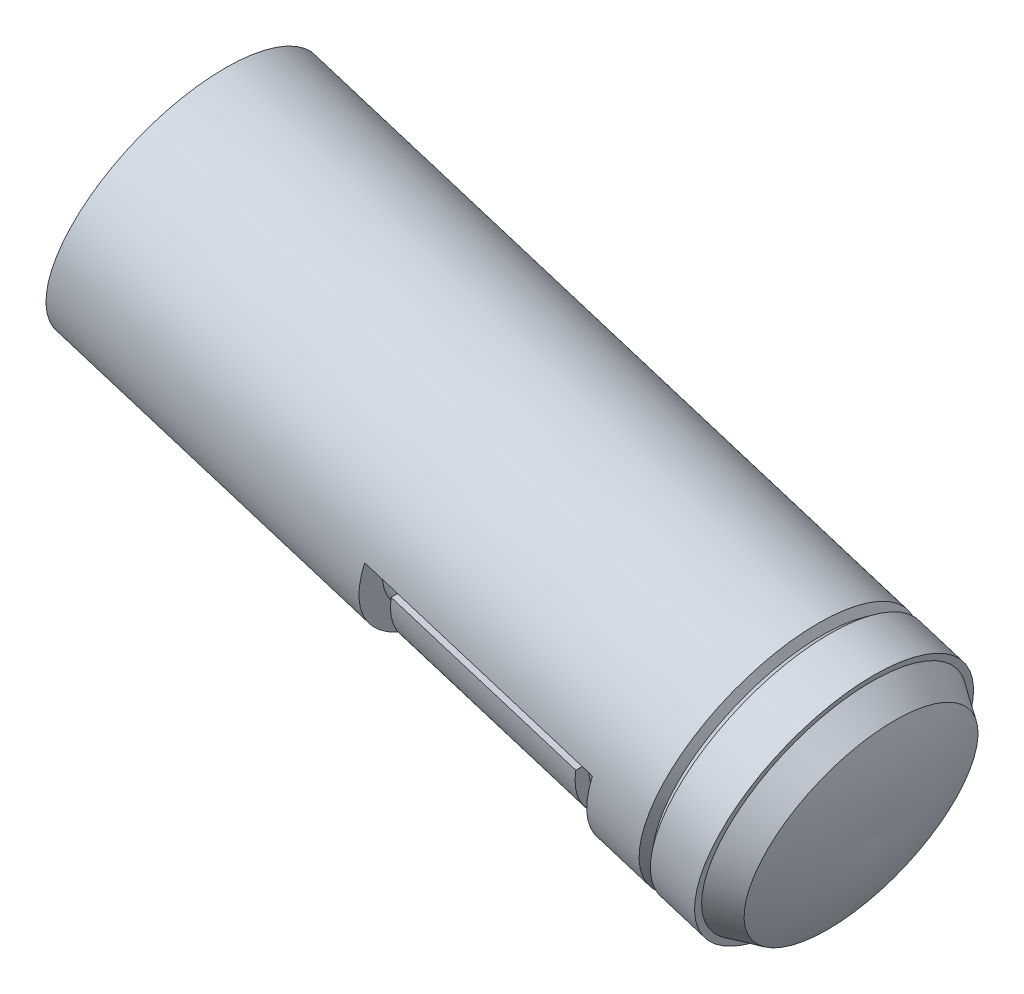
ISO-10303-21;
HEADER;
FILE_DESCRIPTION(('STEP AP214'),'2;1');
FILE_NAME('part.step','',(''),(''),'','','');
FILE_SCHEMA(('AUTOMOTIVE_DESIGN { 1 0 10303 214 1 1 1 1 }'));
ENDSEC;
DATA;
#1=APPLICATION_CONTEXT('core data for automotive mechanical design processes');
#2=APPLICATION_PROTOCOL_DEFINITION('international standard','automotive_design',2000,#1);
#3=PRODUCT_CONTEXT('',#1,'mechanical');
#4=PRODUCT('Part','Part','',(#3));
#5=PRODUCT_RELATED_PRODUCT_CATEGORY('part','',(#4));
#6=PRODUCT_DEFINITION_FORMATION('','',#4);
#7=PRODUCT_DEFINITION_CONTEXT('part definition',#1,'design');
#8=PRODUCT_DEFINITION('design','',#6,#7);
#9=PRODUCT_DEFINITION_SHAPE('','',#8);
#10=(LENGTH_UNIT() NAMED_UNIT(*) SI_UNIT(.MILLI.,.METRE.));
#11=(NAMED_UNIT(*) PLANE_ANGLE_UNIT() SI_UNIT($,.RADIAN.));
#12=(NAMED_UNIT(*) SI_UNIT($,.STERADIAN.) SOLID_ANGLE_UNIT());
#13=UNCERTAINTY_MEASURE_WITH_UNIT(LENGTH_MEASURE(1.E-05),#10,'distance_accuracy_value','');
#14=(GEOMETRIC_REPRESENTATION_CONTEXT(3) GLOBAL_UNCERTAINTY_ASSIGNED_CONTEXT((#13)) GLOBAL_UNIT_ASSIGNED_CONTEXT((#10,
#11,#12)) REPRESENTATION_CONTEXT('',''));
#15=CARTESIAN_POINT('',(0.,0.,0.));
#16=DIRECTION('',(0.,0.,1.));
#17=DIRECTION('',(1.,0.,0.));
#18=AXIS2_PLACEMENT_3D('',#15,#16,#17);
#19=CARTESIAN_POINT('',(483.068426578188,119.269737924205,0.));
#20=DIRECTION('',(0.954946603437544,-0.296777668605806,0.));
#21=DIRECTION('',(0.296777668605806,0.954946603437544,0.));
#22=AXIS2_PLACEMENT_3D('',#19,#20,#21);
#23=CYLINDRICAL_SURFACE('',#22,15.6273171413944);
#24=CARTESIAN_POINT('',(515.085876298242,109.31937625119,0.));
#25=DIRECTION('',(0.954946603437544,-0.296777668605806,0.));
#26=DIRECTION('',(0.296777668605806,0.954946603437544,0.));
#27=AXIS2_PLACEMENT_3D('',#24,#25,#26);
#28=CIRCLE('',#27,15.6273171413944);
#29=CARTESIAN_POINT('',(515.085876298242,109.31937625119,15.6273171413944));
#30=VERTEX_POINT('',#29);
#31=CARTESIAN_POINT('',(515.085876298242,109.31937625119,-15.6273171413944));
#32=VERTEX_POINT('',#31);
#33=EDGE_CURVE('E143',#30,#32,#28,.T.);
#34=ORIENTED_EDGE('',*,*,#33,.F.);
#35=DIRECTION('',(0.954946603437544,-0.296777668605806,0.));
#36=VECTOR('',#35,1.);
#37=CARTESIAN_POINT('',(483.068426578188,119.269737924205,15.6273171413944));
#38=LINE('',#37,#36);
#39=CARTESIAN_POINT('',(483.068426578188,119.269737924205,15.6273171413944));
#40=VERTEX_POINT('',#39);
#41=EDGE_CURVE('E148',#40,#30,#38,.T.);
#42=ORIENTED_EDGE('',*,*,#41,.F.);
#43=CARTESIAN_POINT('',(483.068426578188,119.269737924205,0.));
#44=DIRECTION('',(0.954946603437544,-0.296777668605806,0.));
#45=DIRECTION('',(0.296777668605806,0.954946603437544,0.));
#46=AXIS2_PLACEMENT_3D('',#43,#44,#45);
#47=CIRCLE('',#46,15.6273171413944);
#48=CARTESIAN_POINT('',(483.068426578188,119.269737924205,-15.6273171413944));
#49=VERTEX_POINT('',#48);
#50=EDGE_CURVE('E135',#40,#49,#47,.T.);
#51=ORIENTED_EDGE('',*,*,#50,.T.);
#52=DIRECTION('',(0.954946603437544,-0.296777668605806,0.));
#53=VECTOR('',#52,1.);
#54=CARTESIAN_POINT('',(483.068426578188,119.269737924205,-15.6273171413944));
#55=LINE('',#54,#53);
#56=EDGE_CURVE('E140',#49,#32,#55,.T.);
#57=ORIENTED_EDGE('',*,*,#56,.T.);
#58=EDGE_LOOP('',(#34,#42,#51,#57));
#59=FACE_BOUND('',#58,.T.);
#60=DIRECTION('',(0.954946603437544,-0.296777668605806,0.));
#61=VECTOR('',#60,1.);
#62=CARTESIAN_POINT('',(482.126157480365,116.237782458291,15.3013860822384));
#63=LINE('',#62,#61);
#64=CARTESIAN_POINT('',(485.158112946279,115.295513360468,15.3013860822384));
#65=VERTEX_POINT('',#64);
#66=CARTESIAN_POINT('',(511.111651734505,107.229689883099,15.3013860822384));
#67=VERTEX_POINT('',#66);
#68=EDGE_CURVE('E184',#65,#67,#63,.T.);
#69=ORIENTED_EDGE('',*,*,#68,.T.);
#70=CARTESIAN_POINT('',(512.053920832328,110.261645349013,0.));
#71=DIRECTION('',(-0.954946603437544,0.296777668605806,0.));
#72=DIRECTION('',(-0.296777668605806,-0.954946603437544,0.));
#73=AXIS2_PLACEMENT_3D('',#70,#71,#72);
#74=CIRCLE('',#73,15.6273171413944);
#75=CARTESIAN_POINT('',(511.111651734505,107.229689883099,-15.3013860822384));
#76=VERTEX_POINT('',#75);
#77=EDGE_CURVE('E13',#67,#76,#74,.F.);
#78=ORIENTED_EDGE('',*,*,#77,.T.);
#79=DIRECTION('',(0.954946603437544,-0.296777668605806,0.));
#80=VECTOR('',#79,1.);
#81=CARTESIAN_POINT('',(482.126157480365,116.237782458291,-15.3013860822384));
#82=LINE('',#81,#80);
#83=CARTESIAN_POINT('',(485.158112946279,115.295513360468,-15.3013860822384));
#84=VERTEX_POINT('',#83);
#85=EDGE_CURVE('E45',#76,#84,#82,.F.);
#86=ORIENTED_EDGE('',*,*,#85,.T.);
#87=CARTESIAN_POINT('',(486.100382044102,118.327468826382,0.));
#88=DIRECTION('',(0.954946603437544,-0.296777668605806,0.));
#89=DIRECTION('',(0.296777668605806,0.954946603437544,0.));
#90=AXIS2_PLACEMENT_3D('',#87,#88,#89);
#91=CIRCLE('',#90,15.6273171413944);
#92=EDGE_CURVE('E181',#84,#65,#91,.F.);
#93=ORIENTED_EDGE('',*,*,#92,.T.);
#94=EDGE_LOOP('',(#69,#78,#86,#93));
#95=FACE_BOUND('',#94,.T.);
#96=ADVANCED_FACE('F37',(#59,#95),#23,.T.);
#97=CARTESIAN_POINT('',(439.077442195216,132.941226715156,0.));
#98=DIRECTION('',(-0.954946603437544,0.296777668605806,0.));
#99=DIRECTION('',(-0.296777668605806,-0.954946603437544,0.));
#100=AXIS2_PLACEMENT_3D('',#97,#98,#99);
#101=CYLINDRICAL_SURFACE('',#100,18.8023171413945);
#102=CARTESIAN_POINT('',(522.445357767879,107.03220150776,0.));
#103=DIRECTION('',(-0.954946603437544,0.296777668605806,0.));
#104=DIRECTION('',(-0.296777668605806,-0.954946603437544,0.));
#105=AXIS2_PLACEMENT_3D('',#102,#103,#104);
#106=CIRCLE('',#105,18.8023171413944);
#107=CARTESIAN_POINT('',(516.865249922269,89.07699261683,0.));
#108=VERTEX_POINT('',#107);
#109=EDGE_CURVE('E169',#108,#108,#106,.T.);
#110=ORIENTED_EDGE('',*,*,#109,.T.);
#111=EDGE_LOOP('',(#110));
#112=FACE_BOUND('',#111,.T.);
#113=CARTESIAN_POINT('',(439.077442195216,132.941226715156,0.));
#114=DIRECTION('',(-0.954946603437544,0.296777668605806,0.));
#115=DIRECTION('',(-0.296777668605806,-0.954946603437544,0.));
#116=AXIS2_PLACEMENT_3D('',#113,#114,#115);
#117=CIRCLE('',#116,18.8023171413945);
#118=CARTESIAN_POINT('',(433.497334349606,114.986017824226,0.));
#119=VERTEX_POINT('',#118);
#120=EDGE_CURVE('E151',#119,#119,#117,.T.);
#121=ORIENTED_EDGE('',*,*,#120,.F.);
#122=EDGE_LOOP('',(#121));
#123=FACE_BOUND('',#122,.T.);
#124=CARTESIAN_POINT('',(483.068426578188,119.269737924205,0.));
#125=DIRECTION('',(0.954946603437544,-0.296777668605806,0.));
#126=DIRECTION('',(0.296777668605806,0.954946603437544,0.));
#127=AXIS2_PLACEMENT_3D('',#124,#125,#126);
#128=CIRCLE('',#127,18.8023171413945);
#129=CARTESIAN_POINT('',(483.068426578188,119.269737924205,18.8023171413945));
#130=VERTEX_POINT('',#129);
#131=CARTESIAN_POINT('',(483.068426578188,119.269737924205,-18.8023171413945));
#132=VERTEX_POINT('',#131);
#133=EDGE_CURVE('E179',#130,#132,#128,.T.);
#134=ORIENTED_EDGE('',*,*,#133,.F.);
#135=DIRECTION('',(-0.954946603437544,0.296777668605806,0.));
#136=VECTOR('',#135,1.);
#137=CARTESIAN_POINT('',(439.077442195216,132.941226715156,18.8023171413945));
#138=LINE('',#137,#136);
#139=CARTESIAN_POINT('',(515.085876298242,109.31937625119,18.8023171413945));
#140=VERTEX_POINT('',#139);
#141=EDGE_CURVE('E177',#140,#130,#138,.T.);
#142=ORIENTED_EDGE('',*,*,#141,.F.);
#143=CARTESIAN_POINT('',(515.085876298242,109.31937625119,0.));
#144=DIRECTION('',(0.954946603437544,-0.296777668605806,0.));
#145=DIRECTION('',(0.296777668605806,0.954946603437544,0.));
#146=AXIS2_PLACEMENT_3D('',#143,#144,#145);
#147=CIRCLE('',#146,18.8023171413945);
#148=CARTESIAN_POINT('',(515.085876298242,109.31937625119,-18.8023171413945));
#149=VERTEX_POINT('',#148);
#150=EDGE_CURVE('E172',#140,#149,#147,.T.);
#151=ORIENTED_EDGE('',*,*,#150,.T.);
#152=DIRECTION('',(-0.954946603437544,0.296777668605806,0.));
#153=VECTOR('',#152,1.);
#154=CARTESIAN_POINT('',(439.077442195216,132.941226715156,-18.8023171413945));
#155=LINE('',#154,#153);
#156=EDGE_CURVE('E175',#132,#149,#155,.F.);
#157=ORIENTED_EDGE('',*,*,#156,.F.);
#158=EDGE_LOOP('',(#134,#142,#151,#157));
#159=FACE_BOUND('',#158,.T.);
#160=ADVANCED_FACE('F39',(#112,#123,#159),#101,.T.);
#161=CARTESIAN_POINT('',(523.239107767879,106.785520412076,0.));
#162=DIRECTION('',(-0.954946603437544,0.296777668605806,0.));
#163=DIRECTION('',(-0.296777668605806,-0.954946603437544,0.));
#164=AXIS2_PLACEMENT_3D('',#161,#162,#163);
#165=CONICAL_SURFACE('',#164,17.7551914381778,0.899853225706482);
#166=ORIENTED_EDGE('',*,*,#109,.F.);
#167=EDGE_LOOP('',(#166));
#168=FACE_BOUND('',#167,.T.);
#169=CARTESIAN_POINT('',(523.239107767879,106.785520412076,0.));
#170=DIRECTION('',(-0.954946603437544,0.296777668605806,0.));
#171=DIRECTION('',(-0.296777668605806,-0.954946603437544,0.));
#172=AXIS2_PLACEMENT_3D('',#169,#170,#171);
#173=CIRCLE('',#172,17.7551914381778);
#174=CARTESIAN_POINT('',(517.969763447207,89.8302606548047,0.));
#175=VERTEX_POINT('',#174);
#176=EDGE_CURVE('E166',#175,#175,#173,.T.);
#177=ORIENTED_EDGE('',*,*,#176,.T.);
#178=EDGE_LOOP('',(#177));
#179=FACE_BOUND('',#178,.T.);
#180=ADVANCED_FACE('F205',(#168,#179),#165,.T.);
#181=CARTESIAN_POINT('',(524.032857767879,106.538839316392,0.));
#182=DIRECTION('',(0.954946603437544,-0.296777668605806,0.));
#183=DIRECTION('',(0.296777668605806,0.954946603437544,0.));
#184=AXIS2_PLACEMENT_3D('',#181,#182,#183);
#185=CONICAL_SURFACE('',#184,18.8023171413944,0.899853225706409);
#186=ORIENTED_EDGE('',*,*,#176,.F.);
#187=EDGE_LOOP('',(#186));
#188=FACE_BOUND('',#187,.T.);
#189=CARTESIAN_POINT('',(524.032857767879,106.538839316392,0.));
#190=DIRECTION('',(-0.954946603437544,0.296777668605806,0.));
#191=DIRECTION('',(-0.296777668605806,-0.954946603437544,0.));
#192=AXIS2_PLACEMENT_3D('',#189,#190,#191);
#193=CIRCLE('',#192,18.8023171413944);
#194=CARTESIAN_POINT('',(518.452749922269,88.5836304254617,0.));
#195=VERTEX_POINT('',#194);
#196=EDGE_CURVE('E163',#195,#195,#193,.T.);
#197=ORIENTED_EDGE('',*,*,#196,.T.);
#198=EDGE_LOOP('',(#197));
#199=FACE_BOUND('',#198,.T.);
#200=ADVANCED_FACE('F234',(#188,#199),#185,.T.);
#201=CARTESIAN_POINT('',(439.077442195216,132.941226715156,0.));
#202=DIRECTION('',(-0.954946603437544,0.296777668605806,0.));
#203=DIRECTION('',(-0.296777668605806,-0.954946603437544,0.));
#204=AXIS2_PLACEMENT_3D('',#201,#202,#203);
#205=CYLINDRICAL_SURFACE('',#204,18.8023171413944);
#206=ORIENTED_EDGE('',*,*,#196,.F.);
#207=EDGE_LOOP('',(#206));
#208=FACE_BOUND('',#207,.T.);
#209=CARTESIAN_POINT('',(530.245653627813,104.608030762073,0.));
#210=DIRECTION('',(-0.954946603437544,0.296777668605806,0.));
#211=DIRECTION('',(-0.296777668605806,-0.954946603437544,0.));
#212=AXIS2_PLACEMENT_3D('',#209,#210,#211);
#213=CIRCLE('',#212,18.8023171413945);
#214=CARTESIAN_POINT('',(524.665545782203,86.6528218711427,0.));
#215=VERTEX_POINT('',#214);
#216=EDGE_CURVE('E160',#215,#215,#213,.T.);
#217=ORIENTED_EDGE('',*,*,#216,.T.);
#218=EDGE_LOOP('',(#217));
#219=FACE_BOUND('',#218,.T.);
#220=ADVANCED_FACE('F230',(#208,#219),#205,.T.);
#221=CARTESIAN_POINT('',(535.545433805871,121.661224500594,0.));
#222=DIRECTION('',(-0.954946603437544,0.296777668605806,0.));
#223=DIRECTION('',(-0.296777668605806,-0.954946603437544,0.));
#224=AXIS2_PLACEMENT_3D('',#221,#222,#223);
#225=PLANE('',#224);
#226=ORIENTED_EDGE('',*,*,#216,.F.);
#227=EDGE_LOOP('',(#226));
#228=FACE_BOUND('',#227,.T.);
#229=CARTESIAN_POINT('',(530.245653627813,104.608030762073,0.));
#230=DIRECTION('',(-0.954946603437544,0.296777668605806,0.));
#231=DIRECTION('',(-0.296777668605806,-0.954946603437544,0.));
#232=AXIS2_PLACEMENT_3D('',#229,#230,#231);
#233=CIRCLE('',#232,17.8577458437307);
#234=CARTESIAN_POINT('',(524.945873449756,87.5548370235513,0.));
#235=VERTEX_POINT('',#234);
#236=EDGE_CURVE('E157',#235,#235,#233,.T.);
#237=ORIENTED_EDGE('',*,*,#236,.T.);
#238=EDGE_LOOP('',(#237));
#239=FACE_BOUND('',#238,.T.);
#240=ADVANCED_FACE('F226',(#228,#239),#225,.F.);
#241=CARTESIAN_POINT('',(534.044176085703,103.427528485672,0.));
#242=DIRECTION('',(-0.954946603437544,0.296777668605806,0.));
#243=DIRECTION('',(-0.296777668605806,-0.954946603437544,0.));
#244=AXIS2_PLACEMENT_3D('',#241,#242,#243);
#245=CONICAL_SURFACE('',#244,15.7662147933537,0.484081644638819);
#246=ORIENTED_EDGE('',*,*,#236,.F.);
#247=EDGE_LOOP('',(#246));
#248=FACE_BOUND('',#247,.T.);
#249=CARTESIAN_POINT('',(534.044176085703,103.427528485672,0.));
#250=DIRECTION('',(-0.954946603437544,0.296777668605806,0.));
#251=DIRECTION('',(-0.296777668605806,-0.954946603437544,0.));
#252=AXIS2_PLACEMENT_3D('',#249,#250,#251);
#253=CIRCLE('',#252,15.7662147933537);
#254=CARTESIAN_POINT('',(529.365115616593,88.371635219692,0.));
#255=VERTEX_POINT('',#254);
#256=EDGE_CURVE('E154',#255,#255,#253,.T.);
#257=ORIENTED_EDGE('',*,*,#256,.T.);
#258=EDGE_LOOP('',(#257));
#259=FACE_BOUND('',#258,.T.);
#260=ADVANCED_FACE('F222',(#248,#259),#245,.T.);
#261=CARTESIAN_POINT('',(492.363218322388,113.716272357174,0.));
#262=DIRECTION('',(0.,0.,-1.));
#263=DIRECTION('',(-0.296777668605806,-0.954946603437544,0.));
#264=AXIS2_PLACEMENT_3D('',#261,#262,#263);
#265=CIRCLE('',#264,44.849649218267);
#266=TRIMMED_CURVE('',#265,(PARAMETER_VALUE(-1.62756698040627)),
(PARAMETER_VALUE(1.62756698040627)),.T.,.PARAMETER.);
#267=CARTESIAN_POINT('',(493.118451146278,116.14639799084,0.));
#268=DIRECTION('',(-0.954946603437544,0.296777668605806,0.));
#269=AXIS1_PLACEMENT('',#267,#268);
#270=SURFACE_OF_REVOLUTION('',#266,#269);
#271=ORIENTED_EDGE('',*,*,#256,.F.);
#272=EDGE_LOOP('',(#271));
#273=FACE_BOUND('',#272,.T.);
#274=CARTESIAN_POINT('',(535.878472890044,102.857466948028,0.));
#275=VERTEX_POINT('',#274);
#276=VERTEX_LOOP('',#275);
#277=FACE_BOUND('',#276,.T.);
#278=ADVANCED_FACE('F218',(#273,#277),#270,.T.);
#279=CARTESIAN_POINT('',(444.657550040826,150.896435606086,0.));
#280=DIRECTION('',(0.954946603437544,-0.296777668605806,0.));
#281=DIRECTION('',(0.296777668605806,0.954946603437544,0.));
#282=AXIS2_PLACEMENT_3D('',#279,#280,#281);
#283=PLANE('',#282);
#284=ORIENTED_EDGE('',*,*,#120,.T.);
#285=EDGE_LOOP('',(#284));
#286=FACE_BOUND('',#285,.T.);
#287=ADVANCED_FACE('F214',(#286),#283,.F.);
#288=CARTESIAN_POINT('',(483.068426578188,119.269737924205,19.961709129847));
#289=DIRECTION('',(-0.296777668605806,-0.954946603437544,0.));
#290=DIRECTION('',(0.954946603437544,-0.296777668605806,0.));
#291=AXIS2_PLACEMENT_3D('',#288,#289,#290);
#292=PLANE('',#291);
#293=ORIENTED_EDGE('',*,*,#141,.T.);
#294=DIRECTION('',(0.,0.,-1.));
#295=VECTOR('',#294,1.);
#296=CARTESIAN_POINT('',(483.068426578188,119.269737924205,19.961709129847));
#297=LINE('',#296,#295);
#298=EDGE_CURVE('E133',#130,#40,#297,.T.);
#299=ORIENTED_EDGE('',*,*,#298,.T.);
#300=ORIENTED_EDGE('',*,*,#41,.T.);
#301=DIRECTION('',(0.,0.,-1.));
#302=VECTOR('',#301,1.);
#303=CARTESIAN_POINT('',(515.085876298242,109.31937625119,19.961709129847));
#304=LINE('',#303,#302);
#305=EDGE_CURVE('E141',#140,#30,#304,.T.);
#306=ORIENTED_EDGE('',*,*,#305,.F.);
#307=EDGE_LOOP('',(#293,#299,#300,#306));
#308=FACE_BOUND('',#307,.T.);
#309=ADVANCED_FACE('F212',(#308),#292,.T.);
#310=CARTESIAN_POINT('',(483.068426578188,119.269737924205,-15.6273171413944));
#311=DIRECTION('',(-0.296777668605806,-0.954946603437544,0.));
#312=DIRECTION('',(0.954946603437544,-0.296777668605806,0.));
#313=AXIS2_PLACEMENT_3D('',#310,#311,#312);
#314=PLANE('',#313);
#315=ORIENTED_EDGE('',*,*,#156,.T.);
#316=DIRECTION('',(0.,0.,-1.));
#317=VECTOR('',#316,1.);
#318=CARTESIAN_POINT('',(515.085876298242,109.31937625119,-15.6273171413944));
#319=LINE('',#318,#317);
#320=EDGE_CURVE('E60',#32,#149,#319,.T.);
#321=ORIENTED_EDGE('',*,*,#320,.F.);
#322=ORIENTED_EDGE('',*,*,#56,.F.);
#323=DIRECTION('',(0.,0.,-1.));
#324=VECTOR('',#323,1.);
#325=CARTESIAN_POINT('',(483.068426578188,119.269737924205,-15.6273171413944));
#326=LINE('',#325,#324);
#327=EDGE_CURVE('E137',#49,#132,#326,.T.);
#328=ORIENTED_EDGE('',*,*,#327,.T.);
#329=EDGE_LOOP('',(#315,#321,#322,#328));
#330=FACE_BOUND('',#329,.T.);
#331=ADVANCED_FACE('F210',(#330),#314,.T.);
#332=CARTESIAN_POINT('',(483.068426578188,119.269737924205,0.));
#333=DIRECTION('',(0.954946603437544,-0.296777668605806,0.));
#334=DIRECTION('',(0.296777668605806,0.954946603437544,0.));
#335=AXIS2_PLACEMENT_3D('',#332,#333,#334);
#336=PLANE('',#335);
#337=ORIENTED_EDGE('',*,*,#133,.T.);
#338=ORIENTED_EDGE('',*,*,#327,.F.);
#339=ORIENTED_EDGE('',*,*,#50,.F.);
#340=ORIENTED_EDGE('',*,*,#298,.F.);
#341=EDGE_LOOP('',(#337,#338,#339,#340));
#342=FACE_BOUND('',#341,.T.);
#343=ADVANCED_FACE('F263',(#342),#336,.T.);
#344=CARTESIAN_POINT('',(515.085876298242,109.31937625119,0.));
#345=DIRECTION('',(0.954946603437544,-0.296777668605806,0.));
#346=DIRECTION('',(0.296777668605806,0.954946603437544,0.));
#347=AXIS2_PLACEMENT_3D('',#344,#345,#346);
#348=PLANE('',#347);
#349=ORIENTED_EDGE('',*,*,#305,.T.);
#350=ORIENTED_EDGE('',*,*,#33,.T.);
#351=ORIENTED_EDGE('',*,*,#320,.T.);
#352=ORIENTED_EDGE('',*,*,#150,.F.);
#353=EDGE_LOOP('',(#349,#350,#351,#352));
#354=FACE_BOUND('',#353,.T.);
#355=ADVANCED_FACE('F269',(#354),#348,.F.);
#356=CARTESIAN_POINT('',(446.605663687835,127.27681783213,17.1714379493972));
#357=DIRECTION('',(-0.296777668605806,-0.954946603437544,0.));
#358=DIRECTION('',(0.954946603437544,-0.296777668605806,0.));
#359=AXIS2_PLACEMENT_3D('',#356,#357,#358);
#360=PLANE('',#359);
#361=ORIENTED_EDGE('',*,*,#85,.F.);
#362=DIRECTION('',(0.,0.,-1.));
#363=VECTOR('',#362,1.);
#364=CARTESIAN_POINT('',(511.111651734505,107.229689883099,17.1714379493972));
#365=LINE('',#364,#363);
#366=CARTESIAN_POINT('',(511.111651734505,107.229689883099,-17.1714379493972));
#367=VERTEX_POINT('',#366);
#368=EDGE_CURVE('E120',#76,#367,#365,.T.);
#369=ORIENTED_EDGE('',*,*,#368,.T.);
#370=DIRECTION('',(0.954946603437544,-0.296777668605806,0.));
#371=VECTOR('',#370,1.);
#372=CARTESIAN_POINT('',(446.605663687835,127.27681783213,-17.1714379493972));
#373=LINE('',#372,#371);
#374=CARTESIAN_POINT('',(485.158112946279,115.295513360468,-17.1714379493972));
#375=VERTEX_POINT('',#374);
#376=EDGE_CURVE('E113',#375,#367,#373,.T.);
#377=ORIENTED_EDGE('',*,*,#376,.F.);
#378=DIRECTION('',(0.,0.,1.));
#379=VECTOR('',#378,1.);
#380=CARTESIAN_POINT('',(485.158112946279,115.295513360468,17.1714379493972));
#381=LINE('',#380,#379);
#382=EDGE_CURVE('E130',#375,#84,#381,.T.);
#383=ORIENTED_EDGE('',*,*,#382,.T.);
#384=EDGE_LOOP('',(#361,#369,#377,#383));
#385=FACE_BOUND('',#384,.T.);
#386=ADVANCED_FACE('F188',(#385),#360,.F.);
#387=CARTESIAN_POINT('',(512.053920832328,110.261645349013,0.));
#388=DIRECTION('',(-0.954946603437544,0.296777668605806,0.));
#389=DIRECTION('',(-0.296777668605806,-0.954946603437544,0.));
#390=AXIS2_PLACEMENT_3D('',#387,#388,#389);
#391=PLANE('',#390);
#392=ORIENTED_EDGE('',*,*,#77,.F.);
#393=CARTESIAN_POINT('',(511.111651734505,107.229689883099,17.1714379493972));
#394=VERTEX_POINT('',#393);
#395=EDGE_CURVE('E108',#394,#67,#365,.T.);
#396=ORIENTED_EDGE('',*,*,#395,.F.);
#397=CARTESIAN_POINT('',(512.053920832328,110.261645349013,0.));
#398=DIRECTION('',(-0.954946603437544,0.296777668605806,0.));
#399=DIRECTION('',(-0.296777668605806,-0.954946603437544,0.));
#400=AXIS2_PLACEMENT_3D('',#397,#398,#399);
#401=CIRCLE('',#400,17.4625);
#402=EDGE_CURVE('E119',#367,#394,#401,.T.);
#403=ORIENTED_EDGE('',*,*,#402,.F.);
#404=ORIENTED_EDGE('',*,*,#368,.F.);
#405=EDGE_LOOP('',(#392,#396,#403,#404));
#406=FACE_BOUND('',#405,.T.);
#407=ADVANCED_FACE('F117',(#406),#391,.F.);
#408=ORIENTED_EDGE('',*,*,#68,.F.);
#409=CARTESIAN_POINT('',(485.158112946279,115.295513360468,17.1714379493972));
#410=VERTEX_POINT('',#409);
#411=EDGE_CURVE('E52',#65,#410,#381,.T.);
#412=ORIENTED_EDGE('',*,*,#411,.T.);
#413=DIRECTION('',(0.954946603437544,-0.296777668605806,0.));
#414=VECTOR('',#413,1.);
#415=CARTESIAN_POINT('',(446.605663687835,127.27681783213,17.1714379493972));
#416=LINE('',#415,#414);
#417=EDGE_CURVE('E105',#410,#394,#416,.T.);
#418=ORIENTED_EDGE('',*,*,#417,.T.);
#419=ORIENTED_EDGE('',*,*,#395,.T.);
#420=EDGE_LOOP('',(#408,#412,#418,#419));
#421=FACE_BOUND('',#420,.T.);
#422=ADVANCED_FACE('F107',(#421),#360,.F.);
#423=CARTESIAN_POINT('',(447.547932785658,130.308773298044,0.));
#424=DIRECTION('',(0.954946603437544,-0.296777668605806,0.));
#425=DIRECTION('',(0.296777668605806,0.954946603437544,0.));
#426=AXIS2_PLACEMENT_3D('',#423,#424,#425);
#427=CYLINDRICAL_SURFACE('',#426,17.4625);
#428=ORIENTED_EDGE('',*,*,#417,.F.);
#429=CARTESIAN_POINT('',(486.100382044102,118.327468826382,0.));
#430=DIRECTION('',(0.954946603437544,-0.296777668605806,0.));
#431=DIRECTION('',(0.296777668605806,0.954946603437544,0.));
#432=AXIS2_PLACEMENT_3D('',#429,#430,#431);
#433=CIRCLE('',#432,17.4625);
#434=EDGE_CURVE('E127',#410,#375,#433,.T.);
#435=ORIENTED_EDGE('',*,*,#434,.T.);
#436=ORIENTED_EDGE('',*,*,#376,.T.);
#437=ORIENTED_EDGE('',*,*,#402,.T.);
#438=EDGE_LOOP('',(#428,#435,#436,#437));
#439=FACE_BOUND('',#438,.T.);
#440=ADVANCED_FACE('F123',(#439),#427,.T.);
#441=CARTESIAN_POINT('',(486.100382044102,118.327468826382,0.));
#442=DIRECTION('',(0.954946603437544,-0.296777668605806,0.));
#443=DIRECTION('',(0.296777668605806,0.954946603437544,0.));
#444=AXIS2_PLACEMENT_3D('',#441,#442,#443);
#445=PLANE('',#444);
#446=ORIENTED_EDGE('',*,*,#92,.F.);
#447=ORIENTED_EDGE('',*,*,#382,.F.);
#448=ORIENTED_EDGE('',*,*,#434,.F.);
#449=ORIENTED_EDGE('',*,*,#411,.F.);
#450=EDGE_LOOP('',(#446,#447,#448,#449));
#451=FACE_BOUND('',#450,.T.);
#452=ADVANCED_FACE('F189',(#451),#445,.F.);
#453=CLOSED_SHELL('',(#96,#160,#180,#200,#220,#240,#260,#278,#287,#309,#331,#343,#355,#386,#407,
#422,#440,#452));
#454=MANIFOLD_SOLID_BREP('B2',#453);
#455=ADVANCED_BREP_SHAPE_REPRESENTATION('',(#18,#454),#14);
#456=SHAPE_DEFINITION_REPRESENTATION(#9,#455);
ENDSEC;
END-ISO-10303-21;
